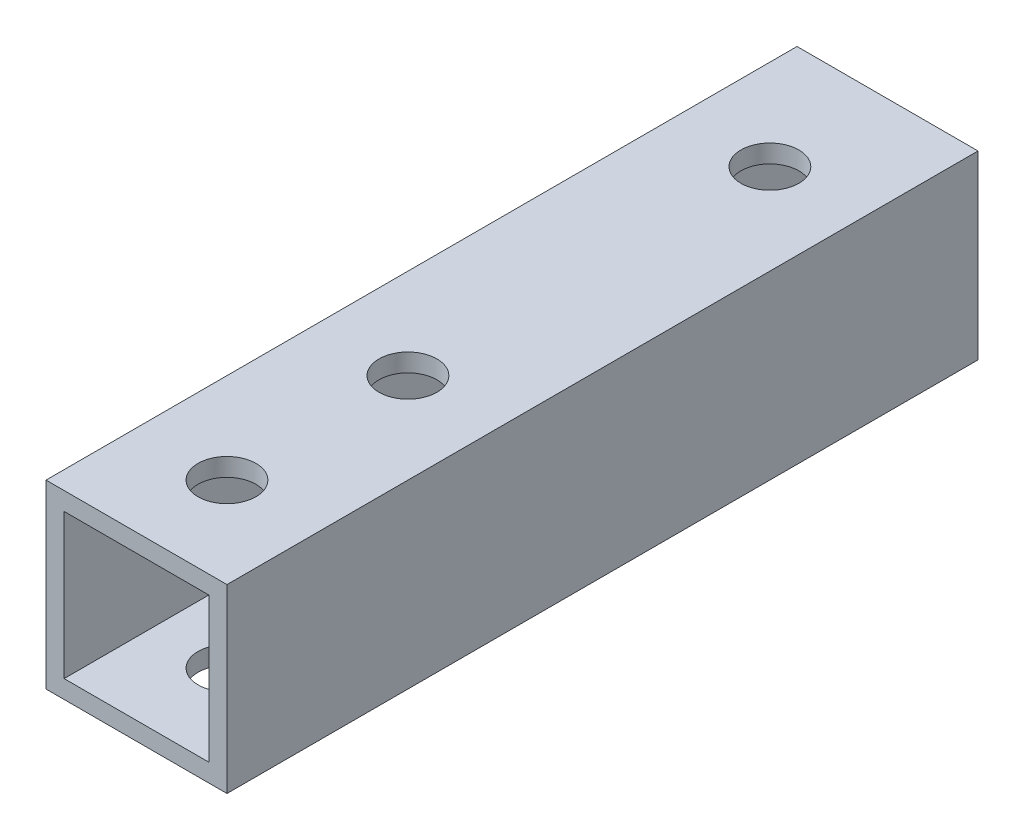
ISO-10303-21;
HEADER;
FILE_DESCRIPTION(('STEP AP214'),'2;1');
FILE_NAME('part.step','',(''),(''),'','','');
FILE_SCHEMA(('AUTOMOTIVE_DESIGN { 1 0 10303 214 1 1 1 1 }'));
ENDSEC;
DATA;
#1=APPLICATION_CONTEXT('core data for automotive mechanical design processes');
#2=APPLICATION_PROTOCOL_DEFINITION('international standard','automotive_design',2000,#1);
#3=PRODUCT_CONTEXT('',#1,'mechanical');
#4=PRODUCT('Part','Part','',(#3));
#5=PRODUCT_RELATED_PRODUCT_CATEGORY('part','',(#4));
#6=PRODUCT_DEFINITION_FORMATION('','',#4);
#7=PRODUCT_DEFINITION_CONTEXT('part definition',#1,'design');
#8=PRODUCT_DEFINITION('design','',#6,#7);
#9=PRODUCT_DEFINITION_SHAPE('','',#8);
#10=(LENGTH_UNIT() NAMED_UNIT(*) SI_UNIT(.MILLI.,.METRE.));
#11=(NAMED_UNIT(*) PLANE_ANGLE_UNIT() SI_UNIT($,.RADIAN.));
#12=(NAMED_UNIT(*) SI_UNIT($,.STERADIAN.) SOLID_ANGLE_UNIT());
#13=UNCERTAINTY_MEASURE_WITH_UNIT(LENGTH_MEASURE(1.E-05),#10,'distance_accuracy_value','');
#14=(GEOMETRIC_REPRESENTATION_CONTEXT(3) GLOBAL_UNCERTAINTY_ASSIGNED_CONTEXT((#13)) GLOBAL_UNIT_ASSIGNED_CONTEXT((#10,
#11,#12)) REPRESENTATION_CONTEXT('',''));
#15=CARTESIAN_POINT('',(0.,0.,0.));
#16=DIRECTION('',(0.,0.,1.));
#17=DIRECTION('',(1.,0.,0.));
#18=AXIS2_PLACEMENT_3D('',#15,#16,#17);
#19=CARTESIAN_POINT('',(0.,0.,41.5));
#20=DIRECTION('',(0.,0.,1.));
#21=DIRECTION('',(1.,0.,0.));
#22=AXIS2_PLACEMENT_3D('',#19,#20,#21);
#23=PLANE('',#22);
#24=DIRECTION('',(0.,1.,0.));
#25=VECTOR('',#24,1.);
#26=CARTESIAN_POINT('',(5.,-5.,41.5));
#27=LINE('',#26,#25);
#28=CARTESIAN_POINT('',(5.,-5.,41.5));
#29=VERTEX_POINT('',#28);
#30=CARTESIAN_POINT('',(5.,5.,41.5));
#31=VERTEX_POINT('',#30);
#32=EDGE_CURVE('E163',#29,#31,#27,.T.);
#33=ORIENTED_EDGE('',*,*,#32,.T.);
#34=DIRECTION('',(-1.,0.,0.));
#35=VECTOR('',#34,1.);
#36=CARTESIAN_POINT('',(-5.,5.,41.5));
#37=LINE('',#36,#35);
#38=CARTESIAN_POINT('',(-5.,5.,41.5));
#39=VERTEX_POINT('',#38);
#40=EDGE_CURVE('E166',#31,#39,#37,.T.);
#41=ORIENTED_EDGE('',*,*,#40,.T.);
#42=DIRECTION('',(0.,-1.,0.));
#43=VECTOR('',#42,1.);
#44=CARTESIAN_POINT('',(-5.,-5.,41.5));
#45=LINE('',#44,#43);
#46=CARTESIAN_POINT('',(-5.,-5.,41.5));
#47=VERTEX_POINT('',#46);
#48=EDGE_CURVE('E169',#39,#47,#45,.T.);
#49=ORIENTED_EDGE('',*,*,#48,.T.);
#50=DIRECTION('',(1.,0.,0.));
#51=VECTOR('',#50,1.);
#52=CARTESIAN_POINT('',(-5.,-5.,41.5));
#53=LINE('',#52,#51);
#54=EDGE_CURVE('E171',#47,#29,#53,.T.);
#55=ORIENTED_EDGE('',*,*,#54,.T.);
#56=EDGE_LOOP('',(#33,#41,#49,#55));
#57=FACE_BOUND('',#56,.T.);
#58=DIRECTION('',(-1.,0.,0.));
#59=VECTOR('',#58,1.);
#60=CARTESIAN_POINT('',(0.,4.,41.5));
#61=LINE('',#60,#59);
#62=CARTESIAN_POINT('',(4.,4.,41.5));
#63=VERTEX_POINT('',#62);
#64=CARTESIAN_POINT('',(-4.,4.,41.5));
#65=VERTEX_POINT('',#64);
#66=EDGE_CURVE('E133',#63,#65,#61,.T.);
#67=ORIENTED_EDGE('',*,*,#66,.F.);
#68=DIRECTION('',(0.,1.,0.));
#69=VECTOR('',#68,1.);
#70=CARTESIAN_POINT('',(4.,0.,41.5));
#71=LINE('',#70,#69);
#72=CARTESIAN_POINT('',(4.,-4.,41.5));
#73=VERTEX_POINT('',#72);
#74=EDGE_CURVE('E125',#73,#63,#71,.T.);
#75=ORIENTED_EDGE('',*,*,#74,.F.);
#76=DIRECTION('',(1.,0.,0.));
#77=VECTOR('',#76,1.);
#78=CARTESIAN_POINT('',(0.,-4.,41.5));
#79=LINE('',#78,#77);
#80=CARTESIAN_POINT('',(-4.,-4.,41.5));
#81=VERTEX_POINT('',#80);
#82=EDGE_CURVE('E147',#81,#73,#79,.T.);
#83=ORIENTED_EDGE('',*,*,#82,.F.);
#84=DIRECTION('',(0.,-1.,0.));
#85=VECTOR('',#84,1.);
#86=CARTESIAN_POINT('',(-4.,0.,41.5));
#87=LINE('',#86,#85);
#88=EDGE_CURVE('E145',#65,#81,#87,.T.);
#89=ORIENTED_EDGE('',*,*,#88,.F.);
#90=EDGE_LOOP('',(#67,#75,#83,#89));
#91=FACE_BOUND('',#90,.T.);
#92=ADVANCED_FACE('F58',(#57,#91),#23,.T.);
#93=CARTESIAN_POINT('',(0.,0.,0.));
#94=DIRECTION('',(0.,0.,1.));
#95=DIRECTION('',(1.,0.,0.));
#96=AXIS2_PLACEMENT_3D('',#93,#94,#95);
#97=PLANE('',#96);
#98=DIRECTION('',(0.,1.,0.));
#99=VECTOR('',#98,1.);
#100=CARTESIAN_POINT('',(5.,-5.,0.));
#101=LINE('',#100,#99);
#102=CARTESIAN_POINT('',(5.,-5.,0.));
#103=VERTEX_POINT('',#102);
#104=CARTESIAN_POINT('',(5.,5.,0.));
#105=VERTEX_POINT('',#104);
#106=EDGE_CURVE('E141',#103,#105,#101,.T.);
#107=ORIENTED_EDGE('',*,*,#106,.F.);
#108=DIRECTION('',(1.,0.,0.));
#109=VECTOR('',#108,1.);
#110=CARTESIAN_POINT('',(-5.,-5.,0.));
#111=LINE('',#110,#109);
#112=CARTESIAN_POINT('',(-5.,-5.,0.));
#113=VERTEX_POINT('',#112);
#114=EDGE_CURVE('E167',#113,#103,#111,.T.);
#115=ORIENTED_EDGE('',*,*,#114,.F.);
#116=DIRECTION('',(0.,-1.,0.));
#117=VECTOR('',#116,1.);
#118=CARTESIAN_POINT('',(-5.,-5.,0.));
#119=LINE('',#118,#117);
#120=CARTESIAN_POINT('',(-5.,5.,0.));
#121=VERTEX_POINT('',#120);
#122=EDGE_CURVE('E178',#121,#113,#119,.T.);
#123=ORIENTED_EDGE('',*,*,#122,.F.);
#124=DIRECTION('',(-1.,0.,0.));
#125=VECTOR('',#124,1.);
#126=CARTESIAN_POINT('',(-5.,5.,0.));
#127=LINE('',#126,#125);
#128=EDGE_CURVE('E176',#105,#121,#127,.T.);
#129=ORIENTED_EDGE('',*,*,#128,.F.);
#130=EDGE_LOOP('',(#107,#115,#123,#129));
#131=FACE_BOUND('',#130,.T.);
#132=DIRECTION('',(0.,1.,0.));
#133=VECTOR('',#132,1.);
#134=CARTESIAN_POINT('',(4.,0.,0.));
#135=LINE('',#134,#133);
#136=CARTESIAN_POINT('',(4.,-4.,0.));
#137=VERTEX_POINT('',#136);
#138=CARTESIAN_POINT('',(4.,4.,0.));
#139=VERTEX_POINT('',#138);
#140=EDGE_CURVE('E83',#137,#139,#135,.T.);
#141=ORIENTED_EDGE('',*,*,#140,.T.);
#142=DIRECTION('',(-1.,0.,0.));
#143=VECTOR('',#142,1.);
#144=CARTESIAN_POINT('',(0.,4.,0.));
#145=LINE('',#144,#143);
#146=CARTESIAN_POINT('',(-4.,4.,0.));
#147=VERTEX_POINT('',#146);
#148=EDGE_CURVE('E140',#139,#147,#145,.T.);
#149=ORIENTED_EDGE('',*,*,#148,.T.);
#150=DIRECTION('',(0.,-1.,0.));
#151=VECTOR('',#150,1.);
#152=CARTESIAN_POINT('',(-4.,0.,0.));
#153=LINE('',#152,#151);
#154=CARTESIAN_POINT('',(-4.,-4.,0.));
#155=VERTEX_POINT('',#154);
#156=EDGE_CURVE('E155',#147,#155,#153,.T.);
#157=ORIENTED_EDGE('',*,*,#156,.T.);
#158=DIRECTION('',(1.,0.,0.));
#159=VECTOR('',#158,1.);
#160=CARTESIAN_POINT('',(0.,-4.,0.));
#161=LINE('',#160,#159);
#162=EDGE_CURVE('E134',#155,#137,#161,.T.);
#163=ORIENTED_EDGE('',*,*,#162,.T.);
#164=EDGE_LOOP('',(#141,#149,#157,#163));
#165=FACE_BOUND('',#164,.T.);
#166=ADVANCED_FACE('F225',(#131,#165),#97,.F.);
#167=CARTESIAN_POINT('',(5.,-5.,41.5));
#168=DIRECTION('',(-1.,0.,0.));
#169=DIRECTION('',(0.,0.,1.));
#170=AXIS2_PLACEMENT_3D('',#167,#168,#169);
#171=PLANE('',#170);
#172=ORIENTED_EDGE('',*,*,#106,.T.);
#173=DIRECTION('',(0.,0.,-1.));
#174=VECTOR('',#173,1.);
#175=CARTESIAN_POINT('',(5.,5.,41.5));
#176=LINE('',#175,#174);
#177=EDGE_CURVE('E12',#31,#105,#176,.T.);
#178=ORIENTED_EDGE('',*,*,#177,.F.);
#179=ORIENTED_EDGE('',*,*,#32,.F.);
#180=DIRECTION('',(0.,0.,-1.));
#181=VECTOR('',#180,1.);
#182=CARTESIAN_POINT('',(5.,-5.,41.5));
#183=LINE('',#182,#181);
#184=EDGE_CURVE('E173',#29,#103,#183,.T.);
#185=ORIENTED_EDGE('',*,*,#184,.T.);
#186=EDGE_LOOP('',(#172,#178,#179,#185));
#187=FACE_BOUND('',#186,.T.);
#188=ADVANCED_FACE('F60',(#187),#171,.F.);
#189=CARTESIAN_POINT('',(-5.,5.,41.5));
#190=DIRECTION('',(0.,-1.,0.));
#191=DIRECTION('',(0.,0.,-1.));
#192=AXIS2_PLACEMENT_3D('',#189,#190,#191);
#193=PLANE('',#192);
#194=CARTESIAN_POINT('',(0.,5.,6.5));
#195=DIRECTION('',(0.,1.,0.));
#196=DIRECTION('',(0.,0.,1.));
#197=AXIS2_PLACEMENT_3D('',#194,#195,#196);
#198=CIRCLE('',#197,1.6);
#199=CARTESIAN_POINT('',(0.,5.,8.1));
#200=VERTEX_POINT('',#199);
#201=EDGE_CURVE('E261',#200,#200,#198,.T.);
#202=ORIENTED_EDGE('',*,*,#201,.F.);
#203=EDGE_LOOP('',(#202));
#204=FACE_BOUND('',#203,.T.);
#205=CARTESIAN_POINT('',(0.,5.,26.5));
#206=DIRECTION('',(0.,1.,0.));
#207=DIRECTION('',(0.,0.,1.));
#208=AXIS2_PLACEMENT_3D('',#205,#206,#207);
#209=CIRCLE('',#208,1.6);
#210=CARTESIAN_POINT('',(0.,5.,28.1));
#211=VERTEX_POINT('',#210);
#212=EDGE_CURVE('E265',#211,#211,#209,.T.);
#213=ORIENTED_EDGE('',*,*,#212,.F.);
#214=EDGE_LOOP('',(#213));
#215=FACE_BOUND('',#214,.T.);
#216=CARTESIAN_POINT('',(0.,5.,36.5));
#217=DIRECTION('',(0.,1.,0.));
#218=DIRECTION('',(0.,0.,1.));
#219=AXIS2_PLACEMENT_3D('',#216,#217,#218);
#220=CIRCLE('',#219,1.6);
#221=CARTESIAN_POINT('',(0.,5.,38.1));
#222=VERTEX_POINT('',#221);
#223=EDGE_CURVE('E269',#222,#222,#220,.T.);
#224=ORIENTED_EDGE('',*,*,#223,.F.);
#225=EDGE_LOOP('',(#224));
#226=FACE_BOUND('',#225,.T.);
#227=ORIENTED_EDGE('',*,*,#128,.T.);
#228=DIRECTION('',(0.,0.,-1.));
#229=VECTOR('',#228,1.);
#230=CARTESIAN_POINT('',(-5.,5.,41.5));
#231=LINE('',#230,#229);
#232=EDGE_CURVE('E67',#39,#121,#231,.T.);
#233=ORIENTED_EDGE('',*,*,#232,.F.);
#234=ORIENTED_EDGE('',*,*,#40,.F.);
#235=ORIENTED_EDGE('',*,*,#177,.T.);
#236=EDGE_LOOP('',(#227,#233,#234,#235));
#237=FACE_BOUND('',#236,.T.);
#238=ADVANCED_FACE('F250',(#204,#215,#226,#237),#193,.F.);
#239=CARTESIAN_POINT('',(-5.,-5.,41.5));
#240=DIRECTION('',(1.,0.,0.));
#241=DIRECTION('',(0.,0.,-1.));
#242=AXIS2_PLACEMENT_3D('',#239,#240,#241);
#243=PLANE('',#242);
#244=ORIENTED_EDGE('',*,*,#122,.T.);
#245=DIRECTION('',(0.,0.,-1.));
#246=VECTOR('',#245,1.);
#247=CARTESIAN_POINT('',(-5.,-5.,41.5));
#248=LINE('',#247,#246);
#249=EDGE_CURVE('E183',#47,#113,#248,.T.);
#250=ORIENTED_EDGE('',*,*,#249,.F.);
#251=ORIENTED_EDGE('',*,*,#48,.F.);
#252=ORIENTED_EDGE('',*,*,#232,.T.);
#253=EDGE_LOOP('',(#244,#250,#251,#252));
#254=FACE_BOUND('',#253,.T.);
#255=ADVANCED_FACE('F247',(#254),#243,.F.);
#256=CARTESIAN_POINT('',(-5.,-5.,41.5));
#257=DIRECTION('',(0.,1.,0.));
#258=DIRECTION('',(0.,0.,1.));
#259=AXIS2_PLACEMENT_3D('',#256,#257,#258);
#260=PLANE('',#259);
#261=CARTESIAN_POINT('',(0.,-5.,6.5));
#262=DIRECTION('',(0.,1.,0.));
#263=DIRECTION('',(0.,0.,1.));
#264=AXIS2_PLACEMENT_3D('',#261,#262,#263);
#265=CIRCLE('',#264,1.6);
#266=CARTESIAN_POINT('',(0.,-5.,8.1));
#267=VERTEX_POINT('',#266);
#268=EDGE_CURVE('E191',#267,#267,#265,.T.);
#269=ORIENTED_EDGE('',*,*,#268,.T.);
#270=EDGE_LOOP('',(#269));
#271=FACE_BOUND('',#270,.T.);
#272=CARTESIAN_POINT('',(0.,-5.,26.5));
#273=DIRECTION('',(0.,1.,0.));
#274=DIRECTION('',(0.,0.,1.));
#275=AXIS2_PLACEMENT_3D('',#272,#273,#274);
#276=CIRCLE('',#275,1.6);
#277=CARTESIAN_POINT('',(0.,-5.,28.1));
#278=VERTEX_POINT('',#277);
#279=EDGE_CURVE('E282',#278,#278,#276,.T.);
#280=ORIENTED_EDGE('',*,*,#279,.T.);
#281=EDGE_LOOP('',(#280));
#282=FACE_BOUND('',#281,.T.);
#283=CARTESIAN_POINT('',(0.,-5.,36.5));
#284=DIRECTION('',(0.,1.,0.));
#285=DIRECTION('',(0.,0.,1.));
#286=AXIS2_PLACEMENT_3D('',#283,#284,#285);
#287=CIRCLE('',#286,1.6);
#288=CARTESIAN_POINT('',(0.,-5.,38.1));
#289=VERTEX_POINT('',#288);
#290=EDGE_CURVE('E204',#289,#289,#287,.T.);
#291=ORIENTED_EDGE('',*,*,#290,.T.);
#292=EDGE_LOOP('',(#291));
#293=FACE_BOUND('',#292,.T.);
#294=ORIENTED_EDGE('',*,*,#114,.T.);
#295=ORIENTED_EDGE('',*,*,#184,.F.);
#296=ORIENTED_EDGE('',*,*,#54,.F.);
#297=ORIENTED_EDGE('',*,*,#249,.T.);
#298=EDGE_LOOP('',(#294,#295,#296,#297));
#299=FACE_BOUND('',#298,.T.);
#300=ADVANCED_FACE('F244',(#271,#282,#293,#299),#260,.F.);
#301=CARTESIAN_POINT('',(4.,0.,41.5));
#302=DIRECTION('',(-1.,0.,0.));
#303=DIRECTION('',(0.,0.,1.));
#304=AXIS2_PLACEMENT_3D('',#301,#302,#303);
#305=PLANE('',#304);
#306=ORIENTED_EDGE('',*,*,#140,.F.);
#307=DIRECTION('',(0.,0.,-1.));
#308=VECTOR('',#307,1.);
#309=CARTESIAN_POINT('',(4.,-4.,41.5));
#310=LINE('',#309,#308);
#311=EDGE_CURVE('E129',#73,#137,#310,.T.);
#312=ORIENTED_EDGE('',*,*,#311,.F.);
#313=ORIENTED_EDGE('',*,*,#74,.T.);
#314=DIRECTION('',(0.,0.,-1.));
#315=VECTOR('',#314,1.);
#316=CARTESIAN_POINT('',(4.,4.,41.5));
#317=LINE('',#316,#315);
#318=EDGE_CURVE('E128',#63,#139,#317,.T.);
#319=ORIENTED_EDGE('',*,*,#318,.T.);
#320=EDGE_LOOP('',(#306,#312,#313,#319));
#321=FACE_BOUND('',#320,.T.);
#322=ADVANCED_FACE('F127',(#321),#305,.T.);
#323=CARTESIAN_POINT('',(0.,4.,41.5));
#324=DIRECTION('',(0.,-1.,0.));
#325=DIRECTION('',(0.,0.,-1.));
#326=AXIS2_PLACEMENT_3D('',#323,#324,#325);
#327=PLANE('',#326);
#328=CARTESIAN_POINT('',(0.,4.,6.5));
#329=DIRECTION('',(0.,-1.,0.));
#330=DIRECTION('',(0.,0.,-1.));
#331=AXIS2_PLACEMENT_3D('',#328,#329,#330);
#332=CIRCLE('',#331,1.6);
#333=CARTESIAN_POINT('',(0.,4.,4.9));
#334=VERTEX_POINT('',#333);
#335=EDGE_CURVE('E153',#334,#334,#332,.T.);
#336=ORIENTED_EDGE('',*,*,#335,.F.);
#337=EDGE_LOOP('',(#336));
#338=FACE_BOUND('',#337,.T.);
#339=CARTESIAN_POINT('',(0.,4.,26.5));
#340=DIRECTION('',(0.,-1.,0.));
#341=DIRECTION('',(0.,0.,-1.));
#342=AXIS2_PLACEMENT_3D('',#339,#340,#341);
#343=CIRCLE('',#342,1.6);
#344=CARTESIAN_POINT('',(0.,4.,24.9));
#345=VERTEX_POINT('',#344);
#346=EDGE_CURVE('E194',#345,#345,#343,.T.);
#347=ORIENTED_EDGE('',*,*,#346,.F.);
#348=EDGE_LOOP('',(#347));
#349=FACE_BOUND('',#348,.T.);
#350=CARTESIAN_POINT('',(0.,4.,36.5));
#351=DIRECTION('',(0.,-1.,0.));
#352=DIRECTION('',(0.,0.,-1.));
#353=AXIS2_PLACEMENT_3D('',#350,#351,#352);
#354=CIRCLE('',#353,1.6);
#355=CARTESIAN_POINT('',(0.,4.,34.9));
#356=VERTEX_POINT('',#355);
#357=EDGE_CURVE('E190',#356,#356,#354,.T.);
#358=ORIENTED_EDGE('',*,*,#357,.F.);
#359=EDGE_LOOP('',(#358));
#360=FACE_BOUND('',#359,.T.);
#361=ORIENTED_EDGE('',*,*,#148,.F.);
#362=ORIENTED_EDGE('',*,*,#318,.F.);
#363=ORIENTED_EDGE('',*,*,#66,.T.);
#364=DIRECTION('',(0.,0.,-1.));
#365=VECTOR('',#364,1.);
#366=CARTESIAN_POINT('',(-4.,4.,41.5));
#367=LINE('',#366,#365);
#368=EDGE_CURVE('E142',#65,#147,#367,.T.);
#369=ORIENTED_EDGE('',*,*,#368,.T.);
#370=EDGE_LOOP('',(#361,#362,#363,#369));
#371=FACE_BOUND('',#370,.T.);
#372=ADVANCED_FACE('F137',(#338,#349,#360,#371),#327,.T.);
#373=CARTESIAN_POINT('',(-4.,0.,41.5));
#374=DIRECTION('',(1.,0.,0.));
#375=DIRECTION('',(0.,0.,-1.));
#376=AXIS2_PLACEMENT_3D('',#373,#374,#375);
#377=PLANE('',#376);
#378=ORIENTED_EDGE('',*,*,#156,.F.);
#379=ORIENTED_EDGE('',*,*,#368,.F.);
#380=ORIENTED_EDGE('',*,*,#88,.T.);
#381=DIRECTION('',(0.,0.,-1.));
#382=VECTOR('',#381,1.);
#383=CARTESIAN_POINT('',(-4.,-4.,41.5));
#384=LINE('',#383,#382);
#385=EDGE_CURVE('E75',#81,#155,#384,.T.);
#386=ORIENTED_EDGE('',*,*,#385,.T.);
#387=EDGE_LOOP('',(#378,#379,#380,#386));
#388=FACE_BOUND('',#387,.T.);
#389=ADVANCED_FACE('F219',(#388),#377,.T.);
#390=CARTESIAN_POINT('',(0.,-4.,41.5));
#391=DIRECTION('',(0.,1.,0.));
#392=DIRECTION('',(0.,0.,1.));
#393=AXIS2_PLACEMENT_3D('',#390,#391,#392);
#394=PLANE('',#393);
#395=CARTESIAN_POINT('',(0.,-4.,6.5));
#396=DIRECTION('',(0.,1.,0.));
#397=DIRECTION('',(0.,0.,1.));
#398=AXIS2_PLACEMENT_3D('',#395,#396,#397);
#399=CIRCLE('',#398,1.6);
#400=CARTESIAN_POINT('',(0.,-4.,8.1));
#401=VERTEX_POINT('',#400);
#402=EDGE_CURVE('E62',#401,#401,#399,.T.);
#403=ORIENTED_EDGE('',*,*,#402,.F.);
#404=EDGE_LOOP('',(#403));
#405=FACE_BOUND('',#404,.T.);
#406=CARTESIAN_POINT('',(0.,-4.,26.5));
#407=DIRECTION('',(0.,1.,0.));
#408=DIRECTION('',(0.,0.,1.));
#409=AXIS2_PLACEMENT_3D('',#406,#407,#408);
#410=CIRCLE('',#409,1.6);
#411=CARTESIAN_POINT('',(0.,-4.,28.1));
#412=VERTEX_POINT('',#411);
#413=EDGE_CURVE('E192',#412,#412,#410,.T.);
#414=ORIENTED_EDGE('',*,*,#413,.F.);
#415=EDGE_LOOP('',(#414));
#416=FACE_BOUND('',#415,.T.);
#417=CARTESIAN_POINT('',(0.,-4.,36.5));
#418=DIRECTION('',(0.,1.,0.));
#419=DIRECTION('',(0.,0.,1.));
#420=AXIS2_PLACEMENT_3D('',#417,#418,#419);
#421=CIRCLE('',#420,1.6);
#422=CARTESIAN_POINT('',(0.,-4.,38.1));
#423=VERTEX_POINT('',#422);
#424=EDGE_CURVE('E188',#423,#423,#421,.T.);
#425=ORIENTED_EDGE('',*,*,#424,.F.);
#426=EDGE_LOOP('',(#425));
#427=FACE_BOUND('',#426,.T.);
#428=ORIENTED_EDGE('',*,*,#162,.F.);
#429=ORIENTED_EDGE('',*,*,#385,.F.);
#430=ORIENTED_EDGE('',*,*,#82,.T.);
#431=ORIENTED_EDGE('',*,*,#311,.T.);
#432=EDGE_LOOP('',(#428,#429,#430,#431));
#433=FACE_BOUND('',#432,.T.);
#434=ADVANCED_FACE('F215',(#405,#416,#427,#433),#394,.T.);
#435=CARTESIAN_POINT('',(0.,-5.,36.5));
#436=DIRECTION('',(0.,1.,0.));
#437=DIRECTION('',(0.,0.,1.));
#438=AXIS2_PLACEMENT_3D('',#435,#436,#437);
#439=CYLINDRICAL_SURFACE('',#438,1.6);
#440=ORIENTED_EDGE('',*,*,#424,.T.);
#441=EDGE_LOOP('',(#440));
#442=FACE_BOUND('',#441,.T.);
#443=ORIENTED_EDGE('',*,*,#290,.F.);
#444=EDGE_LOOP('',(#443));
#445=FACE_BOUND('',#444,.T.);
#446=ADVANCED_FACE('F218',(#442,#445),#439,.F.);
#447=CARTESIAN_POINT('',(0.,-5.,26.5));
#448=DIRECTION('',(0.,1.,0.));
#449=DIRECTION('',(0.,0.,1.));
#450=AXIS2_PLACEMENT_3D('',#447,#448,#449);
#451=CYLINDRICAL_SURFACE('',#450,1.6);
#452=ORIENTED_EDGE('',*,*,#413,.T.);
#453=EDGE_LOOP('',(#452));
#454=FACE_BOUND('',#453,.T.);
#455=ORIENTED_EDGE('',*,*,#279,.F.);
#456=EDGE_LOOP('',(#455));
#457=FACE_BOUND('',#456,.T.);
#458=ADVANCED_FACE('F294',(#454,#457),#451,.F.);
#459=CARTESIAN_POINT('',(0.,-5.,6.5));
#460=DIRECTION('',(0.,1.,0.));
#461=DIRECTION('',(0.,0.,1.));
#462=AXIS2_PLACEMENT_3D('',#459,#460,#461);
#463=CYLINDRICAL_SURFACE('',#462,1.6);
#464=ORIENTED_EDGE('',*,*,#402,.T.);
#465=EDGE_LOOP('',(#464));
#466=FACE_BOUND('',#465,.T.);
#467=ORIENTED_EDGE('',*,*,#268,.F.);
#468=EDGE_LOOP('',(#467));
#469=FACE_BOUND('',#468,.T.);
#470=ADVANCED_FACE('F212',(#466,#469),#463,.F.);
#471=ORIENTED_EDGE('',*,*,#357,.T.);
#472=EDGE_LOOP('',(#471));
#473=FACE_BOUND('',#472,.T.);
#474=ORIENTED_EDGE('',*,*,#223,.T.);
#475=EDGE_LOOP('',(#474));
#476=FACE_BOUND('',#475,.T.);
#477=ADVANCED_FACE('F293',(#473,#476),#439,.F.);
#478=ORIENTED_EDGE('',*,*,#346,.T.);
#479=EDGE_LOOP('',(#478));
#480=FACE_BOUND('',#479,.T.);
#481=ORIENTED_EDGE('',*,*,#212,.T.);
#482=EDGE_LOOP('',(#481));
#483=FACE_BOUND('',#482,.T.);
#484=ADVANCED_FACE('F301',(#480,#483),#451,.F.);
#485=ORIENTED_EDGE('',*,*,#335,.T.);
#486=EDGE_LOOP('',(#485));
#487=FACE_BOUND('',#486,.T.);
#488=ORIENTED_EDGE('',*,*,#201,.T.);
#489=EDGE_LOOP('',(#488));
#490=FACE_BOUND('',#489,.T.);
#491=ADVANCED_FACE('F296',(#487,#490),#463,.F.);
#492=CLOSED_SHELL('',(#92,#166,#188,#238,#255,#300,#322,#372,#389,#434,#446,#458,#470,#477,#484,#491));
#493=MANIFOLD_SOLID_BREP('B2',#492);
#494=ADVANCED_BREP_SHAPE_REPRESENTATION('',(#18,#493),#14);
#495=SHAPE_DEFINITION_REPRESENTATION(#9,#494);
ENDSEC;
END-ISO-10303-21;
